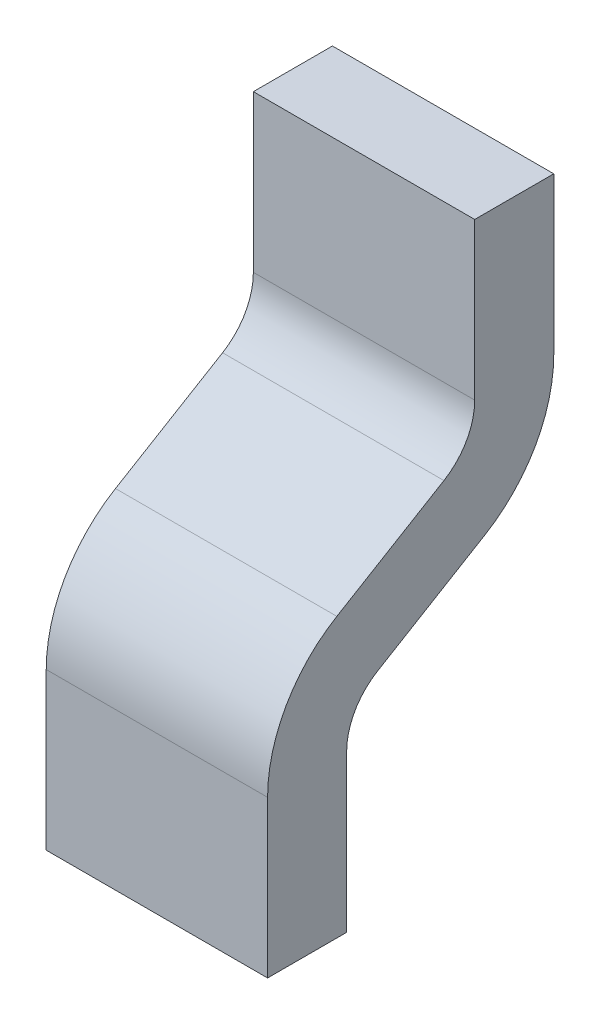
ISO-10303-21;
HEADER;
FILE_DESCRIPTION(('STEP AP214'),'2;1');
FILE_NAME('part.step','',(''),(''),'','','');
FILE_SCHEMA(('AUTOMOTIVE_DESIGN { 1 0 10303 214 1 1 1 1 }'));
ENDSEC;
DATA;
#1=APPLICATION_CONTEXT('core data for automotive mechanical design processes');
#2=APPLICATION_PROTOCOL_DEFINITION('international standard','automotive_design',2000,#1);
#3=PRODUCT_CONTEXT('',#1,'mechanical');
#4=PRODUCT('Part','Part','',(#3));
#5=PRODUCT_RELATED_PRODUCT_CATEGORY('part','',(#4));
#6=PRODUCT_DEFINITION_FORMATION('','',#4);
#7=PRODUCT_DEFINITION_CONTEXT('part definition',#1,'design');
#8=PRODUCT_DEFINITION('design','',#6,#7);
#9=PRODUCT_DEFINITION_SHAPE('','',#8);
#10=(LENGTH_UNIT() NAMED_UNIT(*) SI_UNIT(.MILLI.,.METRE.));
#11=(NAMED_UNIT(*) PLANE_ANGLE_UNIT() SI_UNIT($,.RADIAN.));
#12=(NAMED_UNIT(*) SI_UNIT($,.STERADIAN.) SOLID_ANGLE_UNIT());
#13=UNCERTAINTY_MEASURE_WITH_UNIT(LENGTH_MEASURE(1.E-05),#10,'distance_accuracy_value','');
#14=(GEOMETRIC_REPRESENTATION_CONTEXT(3) GLOBAL_UNCERTAINTY_ASSIGNED_CONTEXT((#13)) GLOBAL_UNIT_ASSIGNED_CONTEXT((#10,
#11,#12)) REPRESENTATION_CONTEXT('',''));
#15=CARTESIAN_POINT('',(0.,0.,0.));
#16=DIRECTION('',(0.,0.,1.));
#17=DIRECTION('',(1.,0.,0.));
#18=AXIS2_PLACEMENT_3D('',#15,#16,#17);
#19=CARTESIAN_POINT('',(0.,4.35,-2.425));
#20=DIRECTION('',(0.,1.,0.));
#21=DIRECTION('',(0.,0.,1.));
#22=AXIS2_PLACEMENT_3D('',#19,#20,#21);
#23=PLANE('',#22);
#24=DIRECTION('',(1.,0.,0.));
#25=VECTOR('',#24,1.);
#26=CARTESIAN_POINT('',(0.,4.35,-2.425));
#27=LINE('',#26,#25);
#28=CARTESIAN_POINT('',(-0.35,4.35,-2.425));
#29=VERTEX_POINT('',#28);
#30=CARTESIAN_POINT('',(0.35,4.35,-2.425));
#31=VERTEX_POINT('',#30);
#32=EDGE_CURVE('E11',#29,#31,#27,.T.);
#33=ORIENTED_EDGE('',*,*,#32,.F.);
#34=DIRECTION('',(0.,0.,1.));
#35=VECTOR('',#34,1.);
#36=CARTESIAN_POINT('',(-0.35,4.35,-2.3));
#37=LINE('',#36,#35);
#38=CARTESIAN_POINT('',(-0.35,4.35,-2.175));
#39=VERTEX_POINT('',#38);
#40=EDGE_CURVE('E25',#29,#39,#37,.T.);
#41=ORIENTED_EDGE('',*,*,#40,.T.);
#42=DIRECTION('',(1.,0.,0.));
#43=VECTOR('',#42,1.);
#44=CARTESIAN_POINT('',(0.,4.35,-2.175));
#45=LINE('',#44,#43);
#46=CARTESIAN_POINT('',(0.35,4.35,-2.175));
#47=VERTEX_POINT('',#46);
#48=EDGE_CURVE('E124',#39,#47,#45,.T.);
#49=ORIENTED_EDGE('',*,*,#48,.T.);
#50=DIRECTION('',(0.,0.,1.));
#51=VECTOR('',#50,1.);
#52=CARTESIAN_POINT('',(0.35,4.35,-2.3));
#53=LINE('',#52,#51);
#54=EDGE_CURVE('E222',#31,#47,#53,.T.);
#55=ORIENTED_EDGE('',*,*,#54,.F.);
#56=EDGE_LOOP('',(#33,#41,#49,#55));
#57=FACE_BOUND('',#56,.T.);
#58=ADVANCED_FACE('F17',(#57),#23,.T.);
#59=CARTESIAN_POINT('',(0.35,0.,0.));
#60=DIRECTION('',(1.,0.,0.));
#61=DIRECTION('',(0.,1.,0.));
#62=AXIS2_PLACEMENT_3D('',#59,#60,#61);
#63=PLANE('',#62);
#64=ORIENTED_EDGE('',*,*,#54,.T.);
#65=DIRECTION('',(0.,-1.,0.));
#66=VECTOR('',#65,1.);
#67=CARTESIAN_POINT('',(0.35,4.1025974026,-2.175));
#68=LINE('',#67,#66);
#69=CARTESIAN_POINT('',(0.35,3.85519480519,-2.175));
#70=VERTEX_POINT('',#69);
#71=EDGE_CURVE('E218',#47,#70,#68,.T.);
#72=ORIENTED_EDGE('',*,*,#71,.T.);
#73=CARTESIAN_POINT('',(0.35,3.85519480519,-1.975));
#74=DIRECTION('',(1.,0.,0.));
#75=DIRECTION('',(0.,-1.,0.));
#76=AXIS2_PLACEMENT_3D('',#73,#74,#75);
#77=CIRCLE('',#76,0.2);
#78=CARTESIAN_POINT('',(0.35,3.68355474961,-2.07766299878));
#79=VERTEX_POINT('',#78);
#80=EDGE_CURVE('E118',#79,#70,#77,.T.);
#81=ORIENTED_EDGE('',*,*,#80,.F.);
#82=DIRECTION('',(0.,-0.513314993903098,0.858200277927164));
#83=VECTOR('',#82,1.);
#84=CARTESIAN_POINT('',(0.35,3.58227503474,-1.90833562576));
#85=LINE('',#84,#83);
#86=CARTESIAN_POINT('',(0.35,3.48099531987,-1.73900825274));
#87=VERTEX_POINT('',#86);
#88=EDGE_CURVE('E211',#79,#87,#85,.T.);
#89=ORIENTED_EDGE('',*,*,#88,.T.);
#90=CARTESIAN_POINT('',(0.35,3.09480519481,-1.97));
#91=DIRECTION('',(1.,0.,0.));
#92=DIRECTION('',(0.,-1.,0.));
#93=AXIS2_PLACEMENT_3D('',#90,#91,#92);
#94=CIRCLE('',#93,0.45);
#95=CARTESIAN_POINT('',(0.35,3.09480519481,-1.52));
#96=VERTEX_POINT('',#95);
#97=EDGE_CURVE('E207',#87,#96,#94,.T.);
#98=ORIENTED_EDGE('',*,*,#97,.T.);
#99=DIRECTION('',(0.,-1.,0.));
#100=VECTOR('',#99,1.);
#101=CARTESIAN_POINT('',(0.35,2.8474025974,-1.52));
#102=LINE('',#101,#100);
#103=CARTESIAN_POINT('',(0.35,2.6,-1.52));
#104=VERTEX_POINT('',#103);
#105=EDGE_CURVE('E203',#96,#104,#102,.T.);
#106=ORIENTED_EDGE('',*,*,#105,.T.);
#107=DIRECTION('',(0.,0.,-1.));
#108=VECTOR('',#107,1.);
#109=CARTESIAN_POINT('',(0.35,2.6,-1.645));
#110=LINE('',#109,#108);
#111=CARTESIAN_POINT('',(0.35,2.6,-1.77));
#112=VERTEX_POINT('',#111);
#113=EDGE_CURVE('E199',#104,#112,#110,.T.);
#114=ORIENTED_EDGE('',*,*,#113,.T.);
#115=DIRECTION('',(0.,1.,0.));
#116=VECTOR('',#115,1.);
#117=CARTESIAN_POINT('',(0.35,2.8474025974,-1.77));
#118=LINE('',#117,#116);
#119=CARTESIAN_POINT('',(0.35,3.09480519481,-1.77));
#120=VERTEX_POINT('',#119);
#121=EDGE_CURVE('E195',#112,#120,#118,.T.);
#122=ORIENTED_EDGE('',*,*,#121,.T.);
#123=CARTESIAN_POINT('',(0.35,3.09480519481,-1.97));
#124=DIRECTION('',(1.,0.,0.));
#125=DIRECTION('',(0.,-1.,0.));
#126=AXIS2_PLACEMENT_3D('',#123,#124,#125);
#127=CIRCLE('',#126,0.2);
#128=CARTESIAN_POINT('',(0.35,3.26644525039,-1.86733700122));
#129=VERTEX_POINT('',#128);
#130=EDGE_CURVE('E190',#129,#120,#127,.T.);
#131=ORIENTED_EDGE('',*,*,#130,.F.);
#132=DIRECTION('',(0.,0.513314993903098,-0.858200277927164));
#133=VECTOR('',#132,1.);
#134=CARTESIAN_POINT('',(0.35,3.36772496526,-2.03666437424));
#135=LINE('',#134,#133);
#136=CARTESIAN_POINT('',(0.35,3.46900468013,-2.20599174726));
#137=VERTEX_POINT('',#136);
#138=EDGE_CURVE('E186',#129,#137,#135,.T.);
#139=ORIENTED_EDGE('',*,*,#138,.T.);
#140=CARTESIAN_POINT('',(0.35,3.85519480519,-1.975));
#141=DIRECTION('',(1.,0.,0.));
#142=DIRECTION('',(0.,-1.,0.));
#143=AXIS2_PLACEMENT_3D('',#140,#141,#142);
#144=CIRCLE('',#143,0.45);
#145=CARTESIAN_POINT('',(0.35,3.85519480519,-2.425));
#146=VERTEX_POINT('',#145);
#147=EDGE_CURVE('E182',#137,#146,#144,.T.);
#148=ORIENTED_EDGE('',*,*,#147,.T.);
#149=DIRECTION('',(0.,1.,0.));
#150=VECTOR('',#149,1.);
#151=CARTESIAN_POINT('',(0.35,4.1025974026,-2.425));
#152=LINE('',#151,#150);
#153=EDGE_CURVE('E177',#146,#31,#152,.T.);
#154=ORIENTED_EDGE('',*,*,#153,.T.);
#155=EDGE_LOOP('',(#64,#72,#81,#89,#98,#106,#114,#122,#131,#139,#148,#154));
#156=FACE_BOUND('',#155,.T.);
#157=ADVANCED_FACE('F235',(#156),#63,.T.);
#158=CARTESIAN_POINT('',(0.,3.85519480519,-2.425));
#159=DIRECTION('',(0.,0.,-1.));
#160=DIRECTION('',(0.,1.,0.));
#161=AXIS2_PLACEMENT_3D('',#158,#159,#160);
#162=PLANE('',#161);
#163=DIRECTION('',(1.,0.,0.));
#164=VECTOR('',#163,1.);
#165=CARTESIAN_POINT('',(0.,3.85519480519,-2.425));
#166=LINE('',#165,#164);
#167=CARTESIAN_POINT('',(-0.35,3.85519480519,-2.425));
#168=VERTEX_POINT('',#167);
#169=EDGE_CURVE('E172',#168,#146,#166,.T.);
#170=ORIENTED_EDGE('',*,*,#169,.F.);
#171=DIRECTION('',(0.,1.,0.));
#172=VECTOR('',#171,1.);
#173=CARTESIAN_POINT('',(-0.35,4.1025974026,-2.425));
#174=LINE('',#173,#172);
#175=EDGE_CURVE('E168',#168,#29,#174,.T.);
#176=ORIENTED_EDGE('',*,*,#175,.T.);
#177=ORIENTED_EDGE('',*,*,#32,.T.);
#178=ORIENTED_EDGE('',*,*,#153,.F.);
#179=EDGE_LOOP('',(#170,#176,#177,#178));
#180=FACE_BOUND('',#179,.T.);
#181=ADVANCED_FACE('F239',(#180),#162,.T.);
#182=CARTESIAN_POINT('',(-0.35,0.,0.));
#183=DIRECTION('',(1.,0.,0.));
#184=DIRECTION('',(0.,1.,0.));
#185=AXIS2_PLACEMENT_3D('',#182,#183,#184);
#186=PLANE('',#185);
#187=ORIENTED_EDGE('',*,*,#175,.F.);
#188=CARTESIAN_POINT('',(-0.35,3.85519480519,-1.975));
#189=DIRECTION('',(1.,0.,0.));
#190=DIRECTION('',(0.,-1.,0.));
#191=AXIS2_PLACEMENT_3D('',#188,#189,#190);
#192=CIRCLE('',#191,0.45);
#193=CARTESIAN_POINT('',(-0.35,3.46900468013,-2.20599174726));
#194=VERTEX_POINT('',#193);
#195=EDGE_CURVE('E163',#194,#168,#192,.T.);
#196=ORIENTED_EDGE('',*,*,#195,.F.);
#197=DIRECTION('',(0.,0.513314993903098,-0.858200277927164));
#198=VECTOR('',#197,1.);
#199=CARTESIAN_POINT('',(-0.35,3.36772496526,-2.03666437424));
#200=LINE('',#199,#198);
#201=CARTESIAN_POINT('',(-0.35,3.26644525039,-1.86733700122));
#202=VERTEX_POINT('',#201);
#203=EDGE_CURVE('E158',#202,#194,#200,.T.);
#204=ORIENTED_EDGE('',*,*,#203,.F.);
#205=CARTESIAN_POINT('',(-0.35,3.09480519481,-1.97));
#206=DIRECTION('',(1.,0.,0.));
#207=DIRECTION('',(0.,-1.,0.));
#208=AXIS2_PLACEMENT_3D('',#205,#206,#207);
#209=CIRCLE('',#208,0.2);
#210=CARTESIAN_POINT('',(-0.35,3.09480519481,-1.77));
#211=VERTEX_POINT('',#210);
#212=EDGE_CURVE('E154',#202,#211,#209,.T.);
#213=ORIENTED_EDGE('',*,*,#212,.T.);
#214=DIRECTION('',(0.,1.,0.));
#215=VECTOR('',#214,1.);
#216=CARTESIAN_POINT('',(-0.35,2.8474025974,-1.77));
#217=LINE('',#216,#215);
#218=CARTESIAN_POINT('',(-0.35,2.6,-1.77));
#219=VERTEX_POINT('',#218);
#220=EDGE_CURVE('E149',#219,#211,#217,.T.);
#221=ORIENTED_EDGE('',*,*,#220,.F.);
#222=DIRECTION('',(0.,0.,-1.));
#223=VECTOR('',#222,1.);
#224=CARTESIAN_POINT('',(-0.35,2.6,-1.645));
#225=LINE('',#224,#223);
#226=CARTESIAN_POINT('',(-0.35,2.6,-1.52));
#227=VERTEX_POINT('',#226);
#228=EDGE_CURVE('E144',#227,#219,#225,.T.);
#229=ORIENTED_EDGE('',*,*,#228,.F.);
#230=DIRECTION('',(0.,-1.,0.));
#231=VECTOR('',#230,1.);
#232=CARTESIAN_POINT('',(-0.35,2.8474025974,-1.52));
#233=LINE('',#232,#231);
#234=CARTESIAN_POINT('',(-0.35,3.09480519481,-1.52));
#235=VERTEX_POINT('',#234);
#236=EDGE_CURVE('E139',#235,#227,#233,.T.);
#237=ORIENTED_EDGE('',*,*,#236,.F.);
#238=CARTESIAN_POINT('',(-0.35,3.09480519481,-1.97));
#239=DIRECTION('',(1.,0.,0.));
#240=DIRECTION('',(0.,-1.,0.));
#241=AXIS2_PLACEMENT_3D('',#238,#239,#240);
#242=CIRCLE('',#241,0.45);
#243=CARTESIAN_POINT('',(-0.35,3.48099531987,-1.73900825274));
#244=VERTEX_POINT('',#243);
#245=EDGE_CURVE('E134',#244,#235,#242,.T.);
#246=ORIENTED_EDGE('',*,*,#245,.F.);
#247=DIRECTION('',(0.,-0.513314993903098,0.858200277927164));
#248=VECTOR('',#247,1.);
#249=CARTESIAN_POINT('',(-0.35,3.58227503474,-1.90833562576));
#250=LINE('',#249,#248);
#251=CARTESIAN_POINT('',(-0.35,3.68355474961,-2.07766299878));
#252=VERTEX_POINT('',#251);
#253=EDGE_CURVE('E109',#252,#244,#250,.T.);
#254=ORIENTED_EDGE('',*,*,#253,.F.);
#255=CARTESIAN_POINT('',(-0.35,3.85519480519,-1.975));
#256=DIRECTION('',(1.,0.,0.));
#257=DIRECTION('',(0.,-1.,0.));
#258=AXIS2_PLACEMENT_3D('',#255,#256,#257);
#259=CIRCLE('',#258,0.2);
#260=CARTESIAN_POINT('',(-0.35,3.85519480519,-2.175));
#261=VERTEX_POINT('',#260);
#262=EDGE_CURVE('E101',#252,#261,#259,.T.);
#263=ORIENTED_EDGE('',*,*,#262,.T.);
#264=DIRECTION('',(0.,-1.,0.));
#265=VECTOR('',#264,1.);
#266=CARTESIAN_POINT('',(-0.35,4.1025974026,-2.175));
#267=LINE('',#266,#265);
#268=EDGE_CURVE('E106',#39,#261,#267,.T.);
#269=ORIENTED_EDGE('',*,*,#268,.F.);
#270=ORIENTED_EDGE('',*,*,#40,.F.);
#271=EDGE_LOOP('',(#187,#196,#204,#213,#221,#229,#237,#246,#254,#263,#269,#270));
#272=FACE_BOUND('',#271,.T.);
#273=ADVANCED_FACE('F104',(#272),#186,.F.);
#274=CARTESIAN_POINT('',(0.,4.35,-2.175));
#275=DIRECTION('',(0.,0.,1.));
#276=DIRECTION('',(0.,-1.,0.));
#277=AXIS2_PLACEMENT_3D('',#274,#275,#276);
#278=PLANE('',#277);
#279=ORIENTED_EDGE('',*,*,#48,.F.);
#280=ORIENTED_EDGE('',*,*,#268,.T.);
#281=DIRECTION('',(1.,0.,0.));
#282=VECTOR('',#281,1.);
#283=CARTESIAN_POINT('',(0.,3.85519480519,-2.175));
#284=LINE('',#283,#282);
#285=EDGE_CURVE('E116',#261,#70,#284,.T.);
#286=ORIENTED_EDGE('',*,*,#285,.T.);
#287=ORIENTED_EDGE('',*,*,#71,.F.);
#288=EDGE_LOOP('',(#279,#280,#286,#287));
#289=FACE_BOUND('',#288,.T.);
#290=ADVANCED_FACE('F123',(#289),#278,.T.);
#291=CARTESIAN_POINT('',(0.,3.85519480519,-1.975));
#292=DIRECTION('',(1.,0.,0.));
#293=DIRECTION('',(0.,0.493297580618035,0.869860619269773));
#294=AXIS2_PLACEMENT_3D('',#291,#292,#293);
#295=CYLINDRICAL_SURFACE('',#294,0.2);
#296=ORIENTED_EDGE('',*,*,#285,.F.);
#297=ORIENTED_EDGE('',*,*,#262,.F.);
#298=DIRECTION('',(1.,0.,0.));
#299=VECTOR('',#298,1.);
#300=CARTESIAN_POINT('',(0.,3.68355474961,-2.07766299878));
#301=LINE('',#300,#299);
#302=EDGE_CURVE('E121',#252,#79,#301,.T.);
#303=ORIENTED_EDGE('',*,*,#302,.T.);
#304=ORIENTED_EDGE('',*,*,#80,.T.);
#305=EDGE_LOOP('',(#296,#297,#303,#304));
#306=FACE_BOUND('',#305,.T.);
#307=ADVANCED_FACE('F117',(#306),#295,.F.);
#308=CARTESIAN_POINT('',(0.,3.68355474961,-2.07766299878));
#309=DIRECTION('',(0.,0.858200277927164,0.513314993903098));
#310=DIRECTION('',(0.,-0.513314993903098,0.858200277927164));
#311=AXIS2_PLACEMENT_3D('',#308,#309,#310);
#312=PLANE('',#311);
#313=ORIENTED_EDGE('',*,*,#302,.F.);
#314=ORIENTED_EDGE('',*,*,#253,.T.);
#315=DIRECTION('',(1.,0.,0.));
#316=VECTOR('',#315,1.);
#317=CARTESIAN_POINT('',(0.,3.48099531987,-1.73900825274));
#318=LINE('',#317,#316);
#319=EDGE_CURVE('E283',#244,#87,#318,.T.);
#320=ORIENTED_EDGE('',*,*,#319,.T.);
#321=ORIENTED_EDGE('',*,*,#88,.F.);
#322=EDGE_LOOP('',(#313,#314,#320,#321));
#323=FACE_BOUND('',#322,.T.);
#324=ADVANCED_FACE('F288',(#323),#312,.T.);
#325=CARTESIAN_POINT('',(0.,3.09480519481,-1.97));
#326=DIRECTION('',(1.,0.,0.));
#327=DIRECTION('',(0.,-0.49329758061637,-0.869860619270718));
#328=AXIS2_PLACEMENT_3D('',#325,#326,#327);
#329=CYLINDRICAL_SURFACE('',#328,0.45);
#330=ORIENTED_EDGE('',*,*,#319,.F.);
#331=ORIENTED_EDGE('',*,*,#245,.T.);
#332=DIRECTION('',(1.,0.,0.));
#333=VECTOR('',#332,1.);
#334=CARTESIAN_POINT('',(0.,3.09480519481,-1.52));
#335=LINE('',#334,#333);
#336=EDGE_CURVE('E274',#235,#96,#335,.T.);
#337=ORIENTED_EDGE('',*,*,#336,.T.);
#338=ORIENTED_EDGE('',*,*,#97,.F.);
#339=EDGE_LOOP('',(#330,#331,#337,#338));
#340=FACE_BOUND('',#339,.T.);
#341=ADVANCED_FACE('F284',(#340),#329,.T.);
#342=CARTESIAN_POINT('',(0.,3.09480519481,-1.52));
#343=DIRECTION('',(0.,0.,1.));
#344=DIRECTION('',(0.,-1.,0.));
#345=AXIS2_PLACEMENT_3D('',#342,#343,#344);
#346=PLANE('',#345);
#347=ORIENTED_EDGE('',*,*,#336,.F.);
#348=ORIENTED_EDGE('',*,*,#236,.T.);
#349=DIRECTION('',(1.,0.,0.));
#350=VECTOR('',#349,1.);
#351=CARTESIAN_POINT('',(0.,2.6,-1.52));
#352=LINE('',#351,#350);
#353=EDGE_CURVE('E268',#227,#104,#352,.T.);
#354=ORIENTED_EDGE('',*,*,#353,.T.);
#355=ORIENTED_EDGE('',*,*,#105,.F.);
#356=EDGE_LOOP('',(#347,#348,#354,#355));
#357=FACE_BOUND('',#356,.T.);
#358=ADVANCED_FACE('F277',(#357),#346,.T.);
#359=CARTESIAN_POINT('',(0.,2.6,-1.52));
#360=DIRECTION('',(0.,-1.,0.));
#361=DIRECTION('',(0.,0.,-1.));
#362=AXIS2_PLACEMENT_3D('',#359,#360,#361);
#363=PLANE('',#362);
#364=ORIENTED_EDGE('',*,*,#353,.F.);
#365=ORIENTED_EDGE('',*,*,#228,.T.);
#366=DIRECTION('',(1.,0.,0.));
#367=VECTOR('',#366,1.);
#368=CARTESIAN_POINT('',(0.,2.6,-1.77));
#369=LINE('',#368,#367);
#370=EDGE_CURVE('E264',#219,#112,#369,.T.);
#371=ORIENTED_EDGE('',*,*,#370,.T.);
#372=ORIENTED_EDGE('',*,*,#113,.F.);
#373=EDGE_LOOP('',(#364,#365,#371,#372));
#374=FACE_BOUND('',#373,.T.);
#375=ADVANCED_FACE('F270',(#374),#363,.T.);
#376=CARTESIAN_POINT('',(0.,2.6,-1.77));
#377=DIRECTION('',(0.,0.,-1.));
#378=DIRECTION('',(0.,1.,0.));
#379=AXIS2_PLACEMENT_3D('',#376,#377,#378);
#380=PLANE('',#379);
#381=ORIENTED_EDGE('',*,*,#370,.F.);
#382=ORIENTED_EDGE('',*,*,#220,.T.);
#383=DIRECTION('',(1.,0.,0.));
#384=VECTOR('',#383,1.);
#385=CARTESIAN_POINT('',(0.,3.09480519481,-1.77));
#386=LINE('',#385,#384);
#387=EDGE_CURVE('E254',#211,#120,#386,.T.);
#388=ORIENTED_EDGE('',*,*,#387,.T.);
#389=ORIENTED_EDGE('',*,*,#121,.F.);
#390=EDGE_LOOP('',(#381,#382,#388,#389));
#391=FACE_BOUND('',#390,.T.);
#392=ADVANCED_FACE('F265',(#391),#380,.T.);
#393=CARTESIAN_POINT('',(0.,3.09480519481,-1.97));
#394=DIRECTION('',(1.,0.,0.));
#395=DIRECTION('',(0.,-0.493297580618036,-0.869860619269773));
#396=AXIS2_PLACEMENT_3D('',#393,#394,#395);
#397=CYLINDRICAL_SURFACE('',#396,0.2);
#398=ORIENTED_EDGE('',*,*,#387,.F.);
#399=ORIENTED_EDGE('',*,*,#212,.F.);
#400=DIRECTION('',(1.,0.,0.));
#401=VECTOR('',#400,1.);
#402=CARTESIAN_POINT('',(0.,3.26644525039,-1.86733700122));
#403=LINE('',#402,#401);
#404=EDGE_CURVE('E248',#202,#129,#403,.T.);
#405=ORIENTED_EDGE('',*,*,#404,.T.);
#406=ORIENTED_EDGE('',*,*,#130,.T.);
#407=EDGE_LOOP('',(#398,#399,#405,#406));
#408=FACE_BOUND('',#407,.T.);
#409=ADVANCED_FACE('F257',(#408),#397,.F.);
#410=CARTESIAN_POINT('',(0.,3.26644525039,-1.86733700122));
#411=DIRECTION('',(0.,-0.858200277927164,-0.513314993903098));
#412=DIRECTION('',(0.,0.513314993903098,-0.858200277927164));
#413=AXIS2_PLACEMENT_3D('',#410,#411,#412);
#414=PLANE('',#413);
#415=ORIENTED_EDGE('',*,*,#404,.F.);
#416=ORIENTED_EDGE('',*,*,#203,.T.);
#417=DIRECTION('',(1.,0.,0.));
#418=VECTOR('',#417,1.);
#419=CARTESIAN_POINT('',(0.,3.46900468013,-2.20599174726));
#420=LINE('',#419,#418);
#421=EDGE_CURVE('E244',#194,#137,#420,.T.);
#422=ORIENTED_EDGE('',*,*,#421,.T.);
#423=ORIENTED_EDGE('',*,*,#138,.F.);
#424=EDGE_LOOP('',(#415,#416,#422,#423));
#425=FACE_BOUND('',#424,.T.);
#426=ADVANCED_FACE('F250',(#425),#414,.T.);
#427=CARTESIAN_POINT('',(0.,3.85519480519,-1.975));
#428=DIRECTION('',(1.,0.,0.));
#429=DIRECTION('',(0.,0.49329758061637,0.869860619270718));
#430=AXIS2_PLACEMENT_3D('',#427,#428,#429);
#431=CYLINDRICAL_SURFACE('',#430,0.45);
#432=ORIENTED_EDGE('',*,*,#421,.F.);
#433=ORIENTED_EDGE('',*,*,#195,.T.);
#434=ORIENTED_EDGE('',*,*,#169,.T.);
#435=ORIENTED_EDGE('',*,*,#147,.F.);
#436=EDGE_LOOP('',(#432,#433,#434,#435));
#437=FACE_BOUND('',#436,.T.);
#438=ADVANCED_FACE('F245',(#437),#431,.T.);
#439=CLOSED_SHELL('',(#58,#157,#181,#273,#290,#307,#324,#341,#358,#375,#392,#409,#426,#438));
#440=MANIFOLD_SOLID_BREP('B1',#439);
#441=ADVANCED_BREP_SHAPE_REPRESENTATION('',(#18,#440),#14);
#442=SHAPE_DEFINITION_REPRESENTATION(#9,#441);
ENDSEC;
END-ISO-10303-21;
